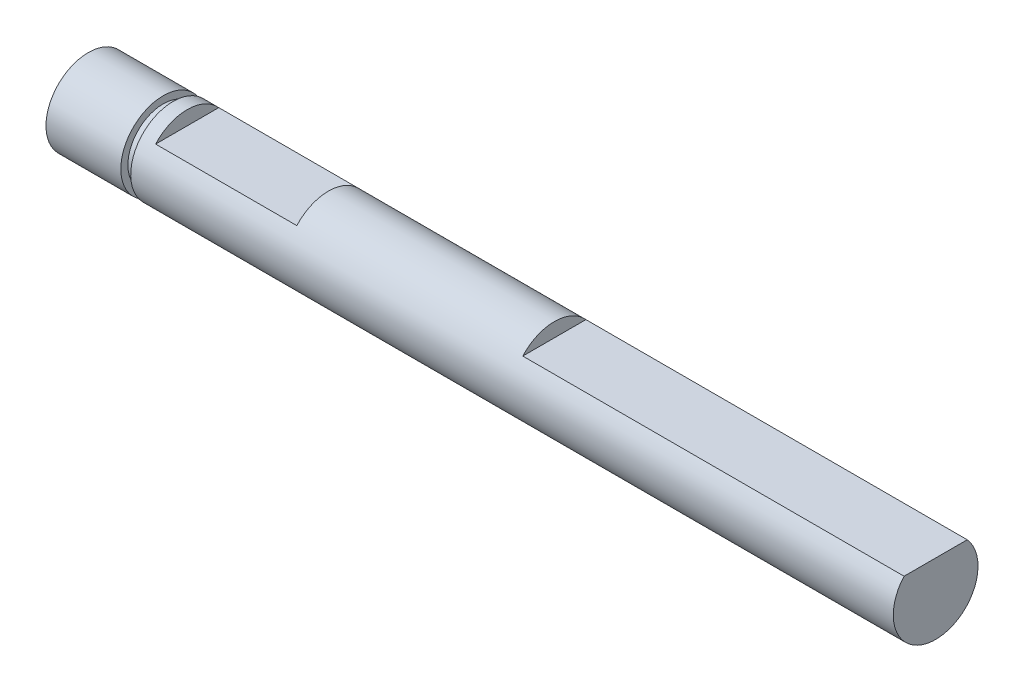
ISO-10303-21;
HEADER;
FILE_DESCRIPTION(('STEP AP214'),'2;1');
FILE_NAME('part.step','',(''),(''),'','','');
FILE_SCHEMA(('AUTOMOTIVE_DESIGN { 1 0 10303 214 1 1 1 1 }'));
ENDSEC;
DATA;
#1=APPLICATION_CONTEXT('core data for automotive mechanical design processes');
#2=APPLICATION_PROTOCOL_DEFINITION('international standard','automotive_design',2000,#1);
#3=PRODUCT_CONTEXT('',#1,'mechanical');
#4=PRODUCT('Part','Part','',(#3));
#5=PRODUCT_RELATED_PRODUCT_CATEGORY('part','',(#4));
#6=PRODUCT_DEFINITION_FORMATION('','',#4);
#7=PRODUCT_DEFINITION_CONTEXT('part definition',#1,'design');
#8=PRODUCT_DEFINITION('design','',#6,#7);
#9=PRODUCT_DEFINITION_SHAPE('','',#8);
#10=(LENGTH_UNIT() NAMED_UNIT(*) SI_UNIT(.MILLI.,.METRE.));
#11=(NAMED_UNIT(*) PLANE_ANGLE_UNIT() SI_UNIT($,.RADIAN.));
#12=(NAMED_UNIT(*) SI_UNIT($,.STERADIAN.) SOLID_ANGLE_UNIT());
#13=UNCERTAINTY_MEASURE_WITH_UNIT(LENGTH_MEASURE(1.E-05),#10,'distance_accuracy_value','');
#14=(GEOMETRIC_REPRESENTATION_CONTEXT(3) GLOBAL_UNCERTAINTY_ASSIGNED_CONTEXT((#13)) GLOBAL_UNIT_ASSIGNED_CONTEXT((#10,
#11,#12)) REPRESENTATION_CONTEXT('',''));
#15=CARTESIAN_POINT('',(0.,0.,0.));
#16=DIRECTION('',(0.,0.,1.));
#17=DIRECTION('',(1.,0.,0.));
#18=AXIS2_PLACEMENT_3D('',#15,#16,#17);
#19=CARTESIAN_POINT('',(60.,0.,0.));
#20=DIRECTION('',(1.,0.,0.));
#21=DIRECTION('',(0.,1.,0.));
#22=AXIS2_PLACEMENT_3D('',#19,#20,#21);
#23=CYLINDRICAL_SURFACE('',#22,3.);
#24=CARTESIAN_POINT('',(33.,0.,0.));
#25=DIRECTION('',(-1.,0.,0.));
#26=DIRECTION('',(0.,-1.,0.));
#27=AXIS2_PLACEMENT_3D('',#24,#25,#26);
#28=CIRCLE('',#27,3.);
#29=CARTESIAN_POINT('',(33.,1.99999999999999,-2.23606797749981));
#30=VERTEX_POINT('',#29);
#31=CARTESIAN_POINT('',(33.,1.99999999999999,2.23606797749981));
#32=VERTEX_POINT('',#31);
#33=EDGE_CURVE('E11',#30,#32,#28,.F.);
#34=ORIENTED_EDGE('',*,*,#33,.F.);
#35=DIRECTION('',(1.,0.,0.));
#36=VECTOR('',#35,1.);
#37=CARTESIAN_POINT('',(60.,1.99999999999998,-2.23606797749981));
#38=LINE('',#37,#36);
#39=CARTESIAN_POINT('',(60.,1.99999999999998,-2.23606797749981));
#40=VERTEX_POINT('',#39);
#41=EDGE_CURVE('E74',#40,#30,#38,.F.);
#42=ORIENTED_EDGE('',*,*,#41,.F.);
#43=CARTESIAN_POINT('',(60.,0.,0.));
#44=DIRECTION('',(1.,0.,0.));
#45=DIRECTION('',(0.,1.,0.));
#46=AXIS2_PLACEMENT_3D('',#43,#44,#45);
#47=CIRCLE('',#46,3.);
#48=CARTESIAN_POINT('',(60.,1.99999999999998,2.23606797749981));
#49=VERTEX_POINT('',#48);
#50=EDGE_CURVE('E82',#49,#40,#47,.T.);
#51=ORIENTED_EDGE('',*,*,#50,.F.);
#52=DIRECTION('',(1.,0.,0.));
#53=VECTOR('',#52,1.);
#54=CARTESIAN_POINT('',(60.,1.99999999999998,2.23606797749981));
#55=LINE('',#54,#53);
#56=EDGE_CURVE('E47',#32,#49,#55,.T.);
#57=ORIENTED_EDGE('',*,*,#56,.F.);
#58=EDGE_LOOP('',(#34,#42,#51,#57));
#59=FACE_BOUND('',#58,.T.);
#60=CARTESIAN_POINT('',(7.,0.,0.));
#61=DIRECTION('',(-1.,0.,0.));
#62=DIRECTION('',(0.,-1.,0.));
#63=AXIS2_PLACEMENT_3D('',#60,#61,#62);
#64=CIRCLE('',#63,3.);
#65=CARTESIAN_POINT('',(7.,2.,-2.2360679774998));
#66=VERTEX_POINT('',#65);
#67=CARTESIAN_POINT('',(7.,2.,2.2360679774998));
#68=VERTEX_POINT('',#67);
#69=EDGE_CURVE('E107',#66,#68,#64,.F.);
#70=ORIENTED_EDGE('',*,*,#69,.F.);
#71=DIRECTION('',(1.,0.,0.));
#72=VECTOR('',#71,1.);
#73=CARTESIAN_POINT('',(60.,1.99999999999998,-2.2360679774998));
#74=LINE('',#73,#72);
#75=CARTESIAN_POINT('',(17.,1.99999999999998,-2.2360679774998));
#76=VERTEX_POINT('',#75);
#77=EDGE_CURVE('E79',#66,#76,#74,.T.);
#78=ORIENTED_EDGE('',*,*,#77,.T.);
#79=CARTESIAN_POINT('',(17.,0.,0.));
#80=DIRECTION('',(1.,0.,0.));
#81=DIRECTION('',(0.,1.,0.));
#82=AXIS2_PLACEMENT_3D('',#79,#80,#81);
#83=CIRCLE('',#82,3.);
#84=CARTESIAN_POINT('',(17.,1.99999999999999,2.2360679774998));
#85=VERTEX_POINT('',#84);
#86=EDGE_CURVE('E54',#85,#76,#83,.F.);
#87=ORIENTED_EDGE('',*,*,#86,.F.);
#88=DIRECTION('',(1.,0.,0.));
#89=VECTOR('',#88,1.);
#90=CARTESIAN_POINT('',(60.,1.99999999999998,2.2360679774998));
#91=LINE('',#90,#89);
#92=EDGE_CURVE('E109',#85,#68,#91,.F.);
#93=ORIENTED_EDGE('',*,*,#92,.T.);
#94=EDGE_LOOP('',(#70,#78,#87,#93));
#95=FACE_BOUND('',#94,.T.);
#96=CARTESIAN_POINT('',(6.,0.,0.));
#97=DIRECTION('',(1.,0.,0.));
#98=DIRECTION('',(0.,1.,0.));
#99=AXIS2_PLACEMENT_3D('',#96,#97,#98);
#100=CIRCLE('',#99,3.);
#101=CARTESIAN_POINT('',(6.,3.,0.));
#102=VERTEX_POINT('',#101);
#103=EDGE_CURVE('E86',#102,#102,#100,.T.);
#104=ORIENTED_EDGE('',*,*,#103,.T.);
#105=EDGE_LOOP('',(#104));
#106=FACE_BOUND('',#105,.T.);
#107=ADVANCED_FACE('F32',(#59,#95,#106),#23,.T.);
#108=CARTESIAN_POINT('',(0.,0.,0.));
#109=DIRECTION('',(-1.,0.,0.));
#110=DIRECTION('',(0.,-1.,0.));
#111=AXIS2_PLACEMENT_3D('',#108,#109,#110);
#112=PLANE('',#111);
#113=CARTESIAN_POINT('',(0.,0.,0.));
#114=DIRECTION('',(1.,0.,0.));
#115=DIRECTION('',(0.,1.,0.));
#116=AXIS2_PLACEMENT_3D('',#113,#114,#115);
#117=CIRCLE('',#116,3.);
#118=CARTESIAN_POINT('',(0.,3.,0.));
#119=VERTEX_POINT('',#118);
#120=EDGE_CURVE('E103',#119,#119,#117,.T.);
#121=ORIENTED_EDGE('',*,*,#120,.F.);
#122=EDGE_LOOP('',(#121));
#123=FACE_BOUND('',#122,.T.);
#124=ADVANCED_FACE('F34',(#123),#112,.T.);
#125=CARTESIAN_POINT('',(60.,0.,0.));
#126=DIRECTION('',(1.,0.,0.));
#127=DIRECTION('',(0.,1.,0.));
#128=AXIS2_PLACEMENT_3D('',#125,#126,#127);
#129=CYLINDRICAL_SURFACE('',#128,3.);
#130=ORIENTED_EDGE('',*,*,#120,.T.);
#131=EDGE_LOOP('',(#130));
#132=FACE_BOUND('',#131,.T.);
#133=CARTESIAN_POINT('',(5.3,0.,0.));
#134=DIRECTION('',(1.,0.,0.));
#135=DIRECTION('',(0.,1.,0.));
#136=AXIS2_PLACEMENT_3D('',#133,#134,#135);
#137=CIRCLE('',#136,3.);
#138=CARTESIAN_POINT('',(5.3,3.,0.));
#139=VERTEX_POINT('',#138);
#140=EDGE_CURVE('E100',#139,#139,#137,.T.);
#141=ORIENTED_EDGE('',*,*,#140,.F.);
#142=EDGE_LOOP('',(#141));
#143=FACE_BOUND('',#142,.T.);
#144=ADVANCED_FACE('F140',(#132,#143),#129,.T.);
#145=CARTESIAN_POINT('',(5.3,3.,0.));
#146=DIRECTION('',(1.,0.,0.));
#147=DIRECTION('',(0.,1.,0.));
#148=AXIS2_PLACEMENT_3D('',#145,#146,#147);
#149=PLANE('',#148);
#150=ORIENTED_EDGE('',*,*,#140,.T.);
#151=EDGE_LOOP('',(#150));
#152=FACE_BOUND('',#151,.T.);
#153=CARTESIAN_POINT('',(5.3,0.,0.));
#154=DIRECTION('',(1.,0.,0.));
#155=DIRECTION('',(0.,1.,0.));
#156=AXIS2_PLACEMENT_3D('',#153,#154,#155);
#157=CIRCLE('',#156,2.49999999999999);
#158=CARTESIAN_POINT('',(5.3,2.49999999999999,0.));
#159=VERTEX_POINT('',#158);
#160=EDGE_CURVE('E97',#159,#159,#157,.T.);
#161=ORIENTED_EDGE('',*,*,#160,.F.);
#162=EDGE_LOOP('',(#161));
#163=FACE_BOUND('',#162,.T.);
#164=ADVANCED_FACE('F152',(#152,#163),#149,.T.);
#165=CARTESIAN_POINT('',(60.,0.,0.));
#166=DIRECTION('',(1.,0.,0.));
#167=DIRECTION('',(0.,1.,0.));
#168=AXIS2_PLACEMENT_3D('',#165,#166,#167);
#169=CYLINDRICAL_SURFACE('',#168,2.49999999999999);
#170=ORIENTED_EDGE('',*,*,#160,.T.);
#171=EDGE_LOOP('',(#170));
#172=FACE_BOUND('',#171,.T.);
#173=CARTESIAN_POINT('',(6.,0.,0.));
#174=DIRECTION('',(1.,0.,0.));
#175=DIRECTION('',(0.,1.,0.));
#176=AXIS2_PLACEMENT_3D('',#173,#174,#175);
#177=CIRCLE('',#176,2.49999999999999);
#178=CARTESIAN_POINT('',(6.,2.49999999999999,0.));
#179=VERTEX_POINT('',#178);
#180=EDGE_CURVE('E90',#179,#179,#177,.T.);
#181=ORIENTED_EDGE('',*,*,#180,.F.);
#182=EDGE_LOOP('',(#181));
#183=FACE_BOUND('',#182,.T.);
#184=ADVANCED_FACE('F148',(#172,#183),#169,.T.);
#185=CARTESIAN_POINT('',(6.,2.49999999999999,0.));
#186=DIRECTION('',(-1.,0.,0.));
#187=DIRECTION('',(0.,-1.,0.));
#188=AXIS2_PLACEMENT_3D('',#185,#186,#187);
#189=PLANE('',#188);
#190=ORIENTED_EDGE('',*,*,#180,.T.);
#191=EDGE_LOOP('',(#190));
#192=FACE_BOUND('',#191,.T.);
#193=ORIENTED_EDGE('',*,*,#103,.F.);
#194=EDGE_LOOP('',(#193));
#195=FACE_BOUND('',#194,.T.);
#196=ADVANCED_FACE('F145',(#192,#195),#189,.T.);
#197=CARTESIAN_POINT('',(60.,3.,0.));
#198=DIRECTION('',(1.,0.,0.));
#199=DIRECTION('',(0.,1.,0.));
#200=AXIS2_PLACEMENT_3D('',#197,#198,#199);
#201=PLANE('',#200);
#202=DIRECTION('',(0.,0.,-1.));
#203=VECTOR('',#202,1.);
#204=CARTESIAN_POINT('',(60.,1.99999999999998,0.));
#205=LINE('',#204,#203);
#206=EDGE_CURVE('E40',#49,#40,#205,.T.);
#207=ORIENTED_EDGE('',*,*,#206,.F.);
#208=ORIENTED_EDGE('',*,*,#50,.T.);
#209=EDGE_LOOP('',(#207,#208));
#210=FACE_BOUND('',#209,.T.);
#211=ADVANCED_FACE('F85',(#210),#201,.T.);
#212=CARTESIAN_POINT('',(7.,2.,3.00000000000001));
#213=DIRECTION('',(-1.,0.,0.));
#214=DIRECTION('',(0.,-1.,0.));
#215=AXIS2_PLACEMENT_3D('',#212,#213,#214);
#216=PLANE('',#215);
#217=DIRECTION('',(0.,0.,1.));
#218=VECTOR('',#217,1.);
#219=CARTESIAN_POINT('',(7.,2.,3.00000000000001));
#220=LINE('',#219,#218);
#221=EDGE_CURVE('E83',#66,#68,#220,.T.);
#222=ORIENTED_EDGE('',*,*,#221,.F.);
#223=ORIENTED_EDGE('',*,*,#69,.T.);
#224=EDGE_LOOP('',(#222,#223));
#225=FACE_BOUND('',#224,.T.);
#226=ADVANCED_FACE('F120',(#225),#216,.F.);
#227=CARTESIAN_POINT('',(17.,1.99999999999999,3.));
#228=DIRECTION('',(1.,0.,0.));
#229=DIRECTION('',(0.,1.,0.));
#230=AXIS2_PLACEMENT_3D('',#227,#228,#229);
#231=PLANE('',#230);
#232=ORIENTED_EDGE('',*,*,#86,.T.);
#233=DIRECTION('',(0.,0.,-1.));
#234=VECTOR('',#233,1.);
#235=CARTESIAN_POINT('',(17.,1.99999999999999,3.));
#236=LINE('',#235,#234);
#237=EDGE_CURVE('E87',#85,#76,#236,.T.);
#238=ORIENTED_EDGE('',*,*,#237,.F.);
#239=EDGE_LOOP('',(#232,#238));
#240=FACE_BOUND('',#239,.T.);
#241=ADVANCED_FACE('F133',(#240),#231,.F.);
#242=CARTESIAN_POINT('',(0.,2.,0.));
#243=DIRECTION('',(0.,1.,0.));
#244=DIRECTION('',(-1.,0.,0.));
#245=AXIS2_PLACEMENT_3D('',#242,#243,#244);
#246=PLANE('',#245);
#247=ORIENTED_EDGE('',*,*,#237,.T.);
#248=ORIENTED_EDGE('',*,*,#77,.F.);
#249=ORIENTED_EDGE('',*,*,#221,.T.);
#250=ORIENTED_EDGE('',*,*,#92,.F.);
#251=EDGE_LOOP('',(#247,#248,#249,#250));
#252=FACE_BOUND('',#251,.T.);
#253=ADVANCED_FACE('F118',(#252),#246,.T.);
#254=CARTESIAN_POINT('',(33.,1.99999999999999,3.));
#255=DIRECTION('',(-1.,0.,0.));
#256=DIRECTION('',(0.,-1.,0.));
#257=AXIS2_PLACEMENT_3D('',#254,#255,#256);
#258=PLANE('',#257);
#259=DIRECTION('',(0.,0.,1.));
#260=VECTOR('',#259,1.);
#261=CARTESIAN_POINT('',(33.,1.99999999999999,3.));
#262=LINE('',#261,#260);
#263=EDGE_CURVE('E123',#30,#32,#262,.T.);
#264=ORIENTED_EDGE('',*,*,#263,.F.);
#265=ORIENTED_EDGE('',*,*,#33,.T.);
#266=EDGE_LOOP('',(#264,#265));
#267=FACE_BOUND('',#266,.T.);
#268=ADVANCED_FACE('F125',(#267),#258,.F.);
#269=CARTESIAN_POINT('',(0.,2.,0.));
#270=DIRECTION('',(0.,-1.,0.));
#271=DIRECTION('',(1.,0.,0.));
#272=AXIS2_PLACEMENT_3D('',#269,#270,#271);
#273=PLANE('',#272);
#274=ORIENTED_EDGE('',*,*,#41,.T.);
#275=ORIENTED_EDGE('',*,*,#263,.T.);
#276=ORIENTED_EDGE('',*,*,#56,.T.);
#277=ORIENTED_EDGE('',*,*,#206,.T.);
#278=EDGE_LOOP('',(#274,#275,#276,#277));
#279=FACE_BOUND('',#278,.T.);
#280=ADVANCED_FACE('F73',(#279),#273,.F.);
#281=CLOSED_SHELL('',(#107,#124,#144,#164,#184,#196,#211,#226,#241,#253,#268,#280));
#282=MANIFOLD_SOLID_BREP('B2',#281);
#283=ADVANCED_BREP_SHAPE_REPRESENTATION('',(#18,#282),#14);
#284=SHAPE_DEFINITION_REPRESENTATION(#9,#283);
ENDSEC;
END-ISO-10303-21;
